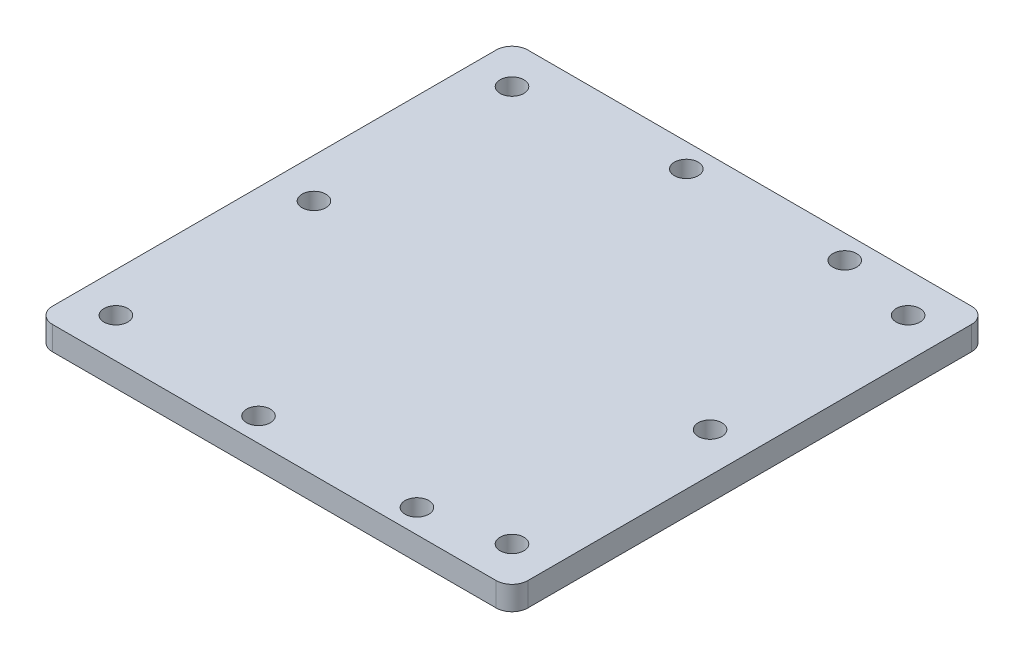
ISO-10303-21;
HEADER;
FILE_DESCRIPTION(('STEP AP214'),'2;1');
FILE_NAME('part.step','',(''),(''),'','','');
FILE_SCHEMA(('AUTOMOTIVE_DESIGN { 1 0 10303 214 1 1 1 1 }'));
ENDSEC;
DATA;
#1=APPLICATION_CONTEXT('core data for automotive mechanical design processes');
#2=APPLICATION_PROTOCOL_DEFINITION('international standard','automotive_design',2000,#1);
#3=PRODUCT_CONTEXT('',#1,'mechanical');
#4=PRODUCT('Part','Part','',(#3));
#5=PRODUCT_RELATED_PRODUCT_CATEGORY('part','',(#4));
#6=PRODUCT_DEFINITION_FORMATION('','',#4);
#7=PRODUCT_DEFINITION_CONTEXT('part definition',#1,'design');
#8=PRODUCT_DEFINITION('design','',#6,#7);
#9=PRODUCT_DEFINITION_SHAPE('','',#8);
#10=(LENGTH_UNIT() NAMED_UNIT(*) SI_UNIT(.MILLI.,.METRE.));
#11=(NAMED_UNIT(*) PLANE_ANGLE_UNIT() SI_UNIT($,.RADIAN.));
#12=(NAMED_UNIT(*) SI_UNIT($,.STERADIAN.) SOLID_ANGLE_UNIT());
#13=UNCERTAINTY_MEASURE_WITH_UNIT(LENGTH_MEASURE(1.E-05),#10,'distance_accuracy_value','');
#14=(GEOMETRIC_REPRESENTATION_CONTEXT(3) GLOBAL_UNCERTAINTY_ASSIGNED_CONTEXT((#13)) GLOBAL_UNIT_ASSIGNED_CONTEXT((#10,
#11,#12)) REPRESENTATION_CONTEXT('',''));
#15=CARTESIAN_POINT('',(0.,0.,0.));
#16=DIRECTION('',(0.,0.,1.));
#17=DIRECTION('',(1.,0.,0.));
#18=AXIS2_PLACEMENT_3D('',#15,#16,#17);
#19=CARTESIAN_POINT('',(0.,3.,0.));
#20=DIRECTION('',(0.,1.,0.));
#21=DIRECTION('',(0.,0.,1.));
#22=AXIS2_PLACEMENT_3D('',#19,#20,#21);
#23=PLANE('',#22);
#24=CARTESIAN_POINT('',(25.,3.,-25.));
#25=DIRECTION('',(0.,1.,0.));
#26=DIRECTION('',(0.,0.,1.));
#27=AXIS2_PLACEMENT_3D('',#24,#25,#26);
#28=CIRCLE('',#27,1.5);
#29=CARTESIAN_POINT('',(25.,3.,-23.5));
#30=VERTEX_POINT('',#29);
#31=EDGE_CURVE('E238',#30,#30,#28,.T.);
#32=ORIENTED_EDGE('',*,*,#31,.F.);
#33=EDGE_LOOP('',(#32));
#34=FACE_BOUND('',#33,.T.);
#35=CARTESIAN_POINT('',(-25.,3.,25.));
#36=DIRECTION('',(0.,1.,0.));
#37=DIRECTION('',(0.,0.,1.));
#38=AXIS2_PLACEMENT_3D('',#35,#36,#37);
#39=CIRCLE('',#38,1.5);
#40=CARTESIAN_POINT('',(-25.,3.,26.5));
#41=VERTEX_POINT('',#40);
#42=EDGE_CURVE('E243',#41,#41,#39,.T.);
#43=ORIENTED_EDGE('',*,*,#42,.F.);
#44=EDGE_LOOP('',(#43));
#45=FACE_BOUND('',#44,.T.);
#46=CARTESIAN_POINT('',(25.,3.,25.));
#47=DIRECTION('',(0.,1.,0.));
#48=DIRECTION('',(0.,0.,1.));
#49=AXIS2_PLACEMENT_3D('',#46,#47,#48);
#50=CIRCLE('',#49,1.5);
#51=CARTESIAN_POINT('',(25.,3.,26.5));
#52=VERTEX_POINT('',#51);
#53=EDGE_CURVE('E244',#52,#52,#50,.T.);
#54=ORIENTED_EDGE('',*,*,#53,.F.);
#55=EDGE_LOOP('',(#54));
#56=FACE_BOUND('',#55,.T.);
#57=CARTESIAN_POINT('',(-25.,3.,-25.));
#58=DIRECTION('',(0.,1.,0.));
#59=DIRECTION('',(0.,0.,1.));
#60=AXIS2_PLACEMENT_3D('',#57,#58,#59);
#61=CIRCLE('',#60,1.5);
#62=CARTESIAN_POINT('',(-25.,3.,-23.5));
#63=VERTEX_POINT('',#62);
#64=EDGE_CURVE('E156',#63,#63,#61,.T.);
#65=ORIENTED_EDGE('',*,*,#64,.F.);
#66=EDGE_LOOP('',(#65));
#67=FACE_BOUND('',#66,.T.);
#68=CARTESIAN_POINT('',(-25.,3.,0.));
#69=DIRECTION('',(0.,1.,0.));
#70=DIRECTION('',(0.,0.,1.));
#71=AXIS2_PLACEMENT_3D('',#68,#69,#70);
#72=CIRCLE('',#71,1.5);
#73=CARTESIAN_POINT('',(-25.,3.,1.50000000000001));
#74=VERTEX_POINT('',#73);
#75=EDGE_CURVE('E223',#74,#74,#72,.T.);
#76=ORIENTED_EDGE('',*,*,#75,.F.);
#77=EDGE_LOOP('',(#76));
#78=FACE_BOUND('',#77,.T.);
#79=CARTESIAN_POINT('',(15.,3.,27.));
#80=DIRECTION('',(0.,1.,0.));
#81=DIRECTION('',(0.,0.,-1.));
#82=AXIS2_PLACEMENT_3D('',#79,#80,#81);
#83=CIRCLE('',#82,1.5);
#84=CARTESIAN_POINT('',(15.,3.,25.5));
#85=VERTEX_POINT('',#84);
#86=EDGE_CURVE('E213',#85,#85,#83,.T.);
#87=ORIENTED_EDGE('',*,*,#86,.F.);
#88=EDGE_LOOP('',(#87));
#89=FACE_BOUND('',#88,.T.);
#90=CARTESIAN_POINT('',(-5.,3.,-27.));
#91=DIRECTION('',(0.,1.,0.));
#92=DIRECTION('',(0.,0.,1.));
#93=AXIS2_PLACEMENT_3D('',#90,#91,#92);
#94=CIRCLE('',#93,1.5);
#95=CARTESIAN_POINT('',(-5.,3.,-25.5));
#96=VERTEX_POINT('',#95);
#97=EDGE_CURVE('E137',#96,#96,#94,.T.);
#98=ORIENTED_EDGE('',*,*,#97,.F.);
#99=EDGE_LOOP('',(#98));
#100=FACE_BOUND('',#99,.T.);
#101=DIRECTION('',(1.,0.,0.));
#102=VECTOR('',#101,1.);
#103=CARTESIAN_POINT('',(-30.,3.,30.));
#104=LINE('',#103,#102);
#105=CARTESIAN_POINT('',(-28.,3.,30.));
#106=VERTEX_POINT('',#105);
#107=CARTESIAN_POINT('',(28.,3.,30.));
#108=VERTEX_POINT('',#107);
#109=EDGE_CURVE('E148',#106,#108,#104,.T.);
#110=ORIENTED_EDGE('',*,*,#109,.T.);
#111=CARTESIAN_POINT('',(28.,3.,28.));
#112=DIRECTION('',(0.,1.,0.));
#113=DIRECTION('',(0.,0.,1.));
#114=AXIS2_PLACEMENT_3D('',#111,#112,#113);
#115=CIRCLE('',#114,2.);
#116=CARTESIAN_POINT('',(30.,3.,28.));
#117=VERTEX_POINT('',#116);
#118=EDGE_CURVE('E179',#108,#117,#115,.T.);
#119=ORIENTED_EDGE('',*,*,#118,.T.);
#120=DIRECTION('',(0.,0.,-1.));
#121=VECTOR('',#120,1.);
#122=CARTESIAN_POINT('',(30.,3.,-30.));
#123=LINE('',#122,#121);
#124=CARTESIAN_POINT('',(30.,3.,-28.));
#125=VERTEX_POINT('',#124);
#126=EDGE_CURVE('E126',#117,#125,#123,.T.);
#127=ORIENTED_EDGE('',*,*,#126,.T.);
#128=CARTESIAN_POINT('',(28.,3.,-28.));
#129=DIRECTION('',(0.,1.,0.));
#130=DIRECTION('',(0.,0.,1.));
#131=AXIS2_PLACEMENT_3D('',#128,#129,#130);
#132=CIRCLE('',#131,2.);
#133=CARTESIAN_POINT('',(28.,3.,-30.));
#134=VERTEX_POINT('',#133);
#135=EDGE_CURVE('E174',#125,#134,#132,.T.);
#136=ORIENTED_EDGE('',*,*,#135,.T.);
#137=DIRECTION('',(-1.,0.,0.));
#138=VECTOR('',#137,1.);
#139=CARTESIAN_POINT('',(-30.,3.,-30.));
#140=LINE('',#139,#138);
#141=CARTESIAN_POINT('',(-28.,3.,-30.));
#142=VERTEX_POINT('',#141);
#143=EDGE_CURVE('E190',#134,#142,#140,.T.);
#144=ORIENTED_EDGE('',*,*,#143,.T.);
#145=CARTESIAN_POINT('',(-28.,3.,-28.));
#146=DIRECTION('',(0.,1.,0.));
#147=DIRECTION('',(0.,0.,1.));
#148=AXIS2_PLACEMENT_3D('',#145,#146,#147);
#149=CIRCLE('',#148,2.);
#150=CARTESIAN_POINT('',(-30.,3.,-28.));
#151=VERTEX_POINT('',#150);
#152=EDGE_CURVE('E61',#142,#151,#149,.T.);
#153=ORIENTED_EDGE('',*,*,#152,.T.);
#154=DIRECTION('',(0.,0.,1.));
#155=VECTOR('',#154,1.);
#156=CARTESIAN_POINT('',(-30.,3.,-30.));
#157=LINE('',#156,#155);
#158=CARTESIAN_POINT('',(-30.,3.,28.));
#159=VERTEX_POINT('',#158);
#160=EDGE_CURVE('E194',#151,#159,#157,.T.);
#161=ORIENTED_EDGE('',*,*,#160,.T.);
#162=CARTESIAN_POINT('',(-28.,3.,28.));
#163=DIRECTION('',(0.,1.,0.));
#164=DIRECTION('',(0.,0.,1.));
#165=AXIS2_PLACEMENT_3D('',#162,#163,#164);
#166=CIRCLE('',#165,2.);
#167=EDGE_CURVE('E176',#159,#106,#166,.T.);
#168=ORIENTED_EDGE('',*,*,#167,.T.);
#169=EDGE_LOOP('',(#110,#119,#127,#136,#144,#153,#161,#168));
#170=FACE_BOUND('',#169,.T.);
#171=CARTESIAN_POINT('',(15.,3.,-27.));
#172=DIRECTION('',(0.,1.,0.));
#173=DIRECTION('',(0.,0.,1.));
#174=AXIS2_PLACEMENT_3D('',#171,#172,#173);
#175=CIRCLE('',#174,1.5);
#176=CARTESIAN_POINT('',(15.,3.,-25.5));
#177=VERTEX_POINT('',#176);
#178=EDGE_CURVE('E208',#177,#177,#175,.T.);
#179=ORIENTED_EDGE('',*,*,#178,.F.);
#180=EDGE_LOOP('',(#179));
#181=FACE_BOUND('',#180,.T.);
#182=CARTESIAN_POINT('',(-5.,3.,27.));
#183=DIRECTION('',(0.,1.,0.));
#184=DIRECTION('',(0.,0.,-1.));
#185=AXIS2_PLACEMENT_3D('',#182,#183,#184);
#186=CIRCLE('',#185,1.5);
#187=CARTESIAN_POINT('',(-5.,3.,25.5));
#188=VERTEX_POINT('',#187);
#189=EDGE_CURVE('E218',#188,#188,#186,.T.);
#190=ORIENTED_EDGE('',*,*,#189,.F.);
#191=EDGE_LOOP('',(#190));
#192=FACE_BOUND('',#191,.T.);
#193=CARTESIAN_POINT('',(25.,3.,0.));
#194=DIRECTION('',(0.,1.,0.));
#195=DIRECTION('',(0.,0.,1.));
#196=AXIS2_PLACEMENT_3D('',#193,#194,#195);
#197=CIRCLE('',#196,1.5);
#198=CARTESIAN_POINT('',(25.,3.,1.5));
#199=VERTEX_POINT('',#198);
#200=EDGE_CURVE('E231',#199,#199,#197,.T.);
#201=ORIENTED_EDGE('',*,*,#200,.F.);
#202=EDGE_LOOP('',(#201));
#203=FACE_BOUND('',#202,.T.);
#204=ADVANCED_FACE('F41',(#34,#45,#56,#67,#78,#89,#100,#170,#181,#192,#203),#23,.T.);
#205=CARTESIAN_POINT('',(0.,0.,0.));
#206=DIRECTION('',(0.,1.,0.));
#207=DIRECTION('',(0.,0.,1.));
#208=AXIS2_PLACEMENT_3D('',#205,#206,#207);
#209=PLANE('',#208);
#210=CARTESIAN_POINT('',(25.,0.,-25.));
#211=DIRECTION('',(0.,1.,0.));
#212=DIRECTION('',(0.,0.,1.));
#213=AXIS2_PLACEMENT_3D('',#210,#211,#212);
#214=CIRCLE('',#213,1.5);
#215=CARTESIAN_POINT('',(25.,0.,-23.5));
#216=VERTEX_POINT('',#215);
#217=EDGE_CURVE('E165',#216,#216,#214,.T.);
#218=ORIENTED_EDGE('',*,*,#217,.T.);
#219=EDGE_LOOP('',(#218));
#220=FACE_BOUND('',#219,.T.);
#221=CARTESIAN_POINT('',(-25.,0.,25.));
#222=DIRECTION('',(0.,1.,0.));
#223=DIRECTION('',(0.,0.,1.));
#224=AXIS2_PLACEMENT_3D('',#221,#222,#223);
#225=CIRCLE('',#224,1.5);
#226=CARTESIAN_POINT('',(-25.,0.,26.5));
#227=VERTEX_POINT('',#226);
#228=EDGE_CURVE('E157',#227,#227,#225,.T.);
#229=ORIENTED_EDGE('',*,*,#228,.T.);
#230=EDGE_LOOP('',(#229));
#231=FACE_BOUND('',#230,.T.);
#232=CARTESIAN_POINT('',(25.,0.,25.));
#233=DIRECTION('',(0.,1.,0.));
#234=DIRECTION('',(0.,0.,1.));
#235=AXIS2_PLACEMENT_3D('',#232,#233,#234);
#236=CIRCLE('',#235,1.5);
#237=CARTESIAN_POINT('',(25.,0.,26.5));
#238=VERTEX_POINT('',#237);
#239=EDGE_CURVE('E154',#238,#238,#236,.T.);
#240=ORIENTED_EDGE('',*,*,#239,.T.);
#241=EDGE_LOOP('',(#240));
#242=FACE_BOUND('',#241,.T.);
#243=CARTESIAN_POINT('',(-25.,0.,-25.));
#244=DIRECTION('',(0.,1.,0.));
#245=DIRECTION('',(0.,0.,1.));
#246=AXIS2_PLACEMENT_3D('',#243,#244,#245);
#247=CIRCLE('',#246,1.5);
#248=CARTESIAN_POINT('',(-25.,0.,-23.5));
#249=VERTEX_POINT('',#248);
#250=EDGE_CURVE('E155',#249,#249,#247,.T.);
#251=ORIENTED_EDGE('',*,*,#250,.T.);
#252=EDGE_LOOP('',(#251));
#253=FACE_BOUND('',#252,.T.);
#254=DIRECTION('',(0.,0.,-1.));
#255=VECTOR('',#254,1.);
#256=CARTESIAN_POINT('',(30.,0.,-30.));
#257=LINE('',#256,#255);
#258=CARTESIAN_POINT('',(30.,0.,28.));
#259=VERTEX_POINT('',#258);
#260=CARTESIAN_POINT('',(30.,0.,-28.));
#261=VERTEX_POINT('',#260);
#262=EDGE_CURVE('E125',#259,#261,#257,.T.);
#263=ORIENTED_EDGE('',*,*,#262,.F.);
#264=CARTESIAN_POINT('',(28.,0.,28.));
#265=DIRECTION('',(0.,1.,0.));
#266=DIRECTION('',(0.,0.,1.));
#267=AXIS2_PLACEMENT_3D('',#264,#265,#266);
#268=CIRCLE('',#267,2.);
#269=CARTESIAN_POINT('',(28.,0.,30.));
#270=VERTEX_POINT('',#269);
#271=EDGE_CURVE('E107',#259,#270,#268,.F.);
#272=ORIENTED_EDGE('',*,*,#271,.T.);
#273=DIRECTION('',(1.,0.,0.));
#274=VECTOR('',#273,1.);
#275=CARTESIAN_POINT('',(-30.,0.,30.));
#276=LINE('',#275,#274);
#277=CARTESIAN_POINT('',(-28.,0.,30.));
#278=VERTEX_POINT('',#277);
#279=EDGE_CURVE('E147',#278,#270,#276,.T.);
#280=ORIENTED_EDGE('',*,*,#279,.F.);
#281=CARTESIAN_POINT('',(-28.,0.,28.));
#282=DIRECTION('',(0.,1.,0.));
#283=DIRECTION('',(0.,0.,1.));
#284=AXIS2_PLACEMENT_3D('',#281,#282,#283);
#285=CIRCLE('',#284,2.);
#286=CARTESIAN_POINT('',(-30.,0.,28.));
#287=VERTEX_POINT('',#286);
#288=EDGE_CURVE('E119',#278,#287,#285,.F.);
#289=ORIENTED_EDGE('',*,*,#288,.T.);
#290=DIRECTION('',(0.,0.,1.));
#291=VECTOR('',#290,1.);
#292=CARTESIAN_POINT('',(-30.,0.,-30.));
#293=LINE('',#292,#291);
#294=CARTESIAN_POINT('',(-30.,0.,-28.));
#295=VERTEX_POINT('',#294);
#296=EDGE_CURVE('E140',#295,#287,#293,.T.);
#297=ORIENTED_EDGE('',*,*,#296,.F.);
#298=CARTESIAN_POINT('',(-28.,0.,-28.));
#299=DIRECTION('',(0.,1.,0.));
#300=DIRECTION('',(0.,0.,1.));
#301=AXIS2_PLACEMENT_3D('',#298,#299,#300);
#302=CIRCLE('',#301,2.);
#303=CARTESIAN_POINT('',(-28.,0.,-30.));
#304=VERTEX_POINT('',#303);
#305=EDGE_CURVE('E129',#295,#304,#302,.F.);
#306=ORIENTED_EDGE('',*,*,#305,.T.);
#307=DIRECTION('',(-1.,0.,0.));
#308=VECTOR('',#307,1.);
#309=CARTESIAN_POINT('',(-30.,0.,-30.));
#310=LINE('',#309,#308);
#311=CARTESIAN_POINT('',(28.,0.,-30.));
#312=VERTEX_POINT('',#311);
#313=EDGE_CURVE('E136',#312,#304,#310,.T.);
#314=ORIENTED_EDGE('',*,*,#313,.F.);
#315=CARTESIAN_POINT('',(28.,0.,-28.));
#316=DIRECTION('',(0.,1.,0.));
#317=DIRECTION('',(0.,0.,1.));
#318=AXIS2_PLACEMENT_3D('',#315,#316,#317);
#319=CIRCLE('',#318,2.);
#320=EDGE_CURVE('E132',#312,#261,#319,.F.);
#321=ORIENTED_EDGE('',*,*,#320,.T.);
#322=EDGE_LOOP('',(#263,#272,#280,#289,#297,#306,#314,#321));
#323=FACE_BOUND('',#322,.T.);
#324=CARTESIAN_POINT('',(-5.,0.,-27.));
#325=DIRECTION('',(0.,1.,0.));
#326=DIRECTION('',(0.,0.,1.));
#327=AXIS2_PLACEMENT_3D('',#324,#325,#326);
#328=CIRCLE('',#327,1.5);
#329=CARTESIAN_POINT('',(-5.,0.,-25.5));
#330=VERTEX_POINT('',#329);
#331=EDGE_CURVE('E141',#330,#330,#328,.T.);
#332=ORIENTED_EDGE('',*,*,#331,.T.);
#333=EDGE_LOOP('',(#332));
#334=FACE_BOUND('',#333,.T.);
#335=CARTESIAN_POINT('',(15.,0.,-27.));
#336=DIRECTION('',(0.,1.,0.));
#337=DIRECTION('',(0.,0.,1.));
#338=AXIS2_PLACEMENT_3D('',#335,#336,#337);
#339=CIRCLE('',#338,1.5);
#340=CARTESIAN_POINT('',(15.,0.,-25.5));
#341=VERTEX_POINT('',#340);
#342=EDGE_CURVE('E209',#341,#341,#339,.T.);
#343=ORIENTED_EDGE('',*,*,#342,.T.);
#344=EDGE_LOOP('',(#343));
#345=FACE_BOUND('',#344,.T.);
#346=CARTESIAN_POINT('',(15.,0.,27.));
#347=DIRECTION('',(0.,1.,0.));
#348=DIRECTION('',(0.,0.,-1.));
#349=AXIS2_PLACEMENT_3D('',#346,#347,#348);
#350=CIRCLE('',#349,1.5);
#351=CARTESIAN_POINT('',(15.,0.,25.5));
#352=VERTEX_POINT('',#351);
#353=EDGE_CURVE('E216',#352,#352,#350,.T.);
#354=ORIENTED_EDGE('',*,*,#353,.T.);
#355=EDGE_LOOP('',(#354));
#356=FACE_BOUND('',#355,.T.);
#357=CARTESIAN_POINT('',(-5.,0.,27.));
#358=DIRECTION('',(0.,1.,0.));
#359=DIRECTION('',(0.,0.,-1.));
#360=AXIS2_PLACEMENT_3D('',#357,#358,#359);
#361=CIRCLE('',#360,1.5);
#362=CARTESIAN_POINT('',(-5.,0.,25.5));
#363=VERTEX_POINT('',#362);
#364=EDGE_CURVE('E225',#363,#363,#361,.T.);
#365=ORIENTED_EDGE('',*,*,#364,.T.);
#366=EDGE_LOOP('',(#365));
#367=FACE_BOUND('',#366,.T.);
#368=CARTESIAN_POINT('',(-25.,0.,0.));
#369=DIRECTION('',(0.,1.,0.));
#370=DIRECTION('',(0.,0.,1.));
#371=AXIS2_PLACEMENT_3D('',#368,#369,#370);
#372=CIRCLE('',#371,1.5);
#373=CARTESIAN_POINT('',(-25.,0.,1.50000000000001));
#374=VERTEX_POINT('',#373);
#375=EDGE_CURVE('E226',#374,#374,#372,.T.);
#376=ORIENTED_EDGE('',*,*,#375,.T.);
#377=EDGE_LOOP('',(#376));
#378=FACE_BOUND('',#377,.T.);
#379=CARTESIAN_POINT('',(25.,0.,0.));
#380=DIRECTION('',(0.,1.,0.));
#381=DIRECTION('',(0.,0.,1.));
#382=AXIS2_PLACEMENT_3D('',#379,#380,#381);
#383=CIRCLE('',#382,1.5);
#384=CARTESIAN_POINT('',(25.,0.,1.5));
#385=VERTEX_POINT('',#384);
#386=EDGE_CURVE('E164',#385,#385,#383,.T.);
#387=ORIENTED_EDGE('',*,*,#386,.T.);
#388=EDGE_LOOP('',(#387));
#389=FACE_BOUND('',#388,.T.);
#390=ADVANCED_FACE('F135',(#220,#231,#242,#253,#323,#334,#345,#356,#367,#378,#389),#209,.F.);
#391=CARTESIAN_POINT('',(30.,3.,-30.));
#392=DIRECTION('',(-1.,0.,0.));
#393=DIRECTION('',(0.,0.,1.));
#394=AXIS2_PLACEMENT_3D('',#391,#392,#393);
#395=PLANE('',#394);
#396=ORIENTED_EDGE('',*,*,#126,.F.);
#397=DIRECTION('',(0.,-1.,0.));
#398=VECTOR('',#397,1.);
#399=CARTESIAN_POINT('',(30.,3.,28.));
#400=LINE('',#399,#398);
#401=EDGE_CURVE('E115',#117,#259,#400,.T.);
#402=ORIENTED_EDGE('',*,*,#401,.T.);
#403=ORIENTED_EDGE('',*,*,#262,.T.);
#404=DIRECTION('',(0.,-1.,0.));
#405=VECTOR('',#404,1.);
#406=CARTESIAN_POINT('',(30.,3.,-28.));
#407=LINE('',#406,#405);
#408=EDGE_CURVE('E128',#261,#125,#407,.F.);
#409=ORIENTED_EDGE('',*,*,#408,.T.);
#410=EDGE_LOOP('',(#396,#402,#403,#409));
#411=FACE_BOUND('',#410,.T.);
#412=ADVANCED_FACE('F123',(#411),#395,.F.);
#413=CARTESIAN_POINT('',(-30.,3.,-30.));
#414=DIRECTION('',(0.,0.,1.));
#415=DIRECTION('',(1.,0.,0.));
#416=AXIS2_PLACEMENT_3D('',#413,#414,#415);
#417=PLANE('',#416);
#418=ORIENTED_EDGE('',*,*,#143,.F.);
#419=DIRECTION('',(0.,-1.,0.));
#420=VECTOR('',#419,1.);
#421=CARTESIAN_POINT('',(28.,3.,-30.));
#422=LINE('',#421,#420);
#423=EDGE_CURVE('E11',#134,#312,#422,.T.);
#424=ORIENTED_EDGE('',*,*,#423,.T.);
#425=ORIENTED_EDGE('',*,*,#313,.T.);
#426=DIRECTION('',(0.,-1.,0.));
#427=VECTOR('',#426,1.);
#428=CARTESIAN_POINT('',(-28.,3.,-30.));
#429=LINE('',#428,#427);
#430=EDGE_CURVE('E47',#304,#142,#429,.F.);
#431=ORIENTED_EDGE('',*,*,#430,.T.);
#432=EDGE_LOOP('',(#418,#424,#425,#431));
#433=FACE_BOUND('',#432,.T.);
#434=ADVANCED_FACE('F188',(#433),#417,.F.);
#435=CARTESIAN_POINT('',(-30.,3.,-30.));
#436=DIRECTION('',(1.,0.,0.));
#437=DIRECTION('',(0.,0.,-1.));
#438=AXIS2_PLACEMENT_3D('',#435,#436,#437);
#439=PLANE('',#438);
#440=ORIENTED_EDGE('',*,*,#296,.T.);
#441=DIRECTION('',(0.,-1.,0.));
#442=VECTOR('',#441,1.);
#443=CARTESIAN_POINT('',(-30.,3.,28.));
#444=LINE('',#443,#442);
#445=EDGE_CURVE('E57',#287,#159,#444,.F.);
#446=ORIENTED_EDGE('',*,*,#445,.T.);
#447=ORIENTED_EDGE('',*,*,#160,.F.);
#448=DIRECTION('',(0.,-1.,0.));
#449=VECTOR('',#448,1.);
#450=CARTESIAN_POINT('',(-30.,3.,-28.));
#451=LINE('',#450,#449);
#452=EDGE_CURVE('E180',#151,#295,#451,.T.);
#453=ORIENTED_EDGE('',*,*,#452,.T.);
#454=EDGE_LOOP('',(#440,#446,#447,#453));
#455=FACE_BOUND('',#454,.T.);
#456=ADVANCED_FACE('F197',(#455),#439,.F.);
#457=CARTESIAN_POINT('',(-30.,3.,30.));
#458=DIRECTION('',(0.,0.,-1.));
#459=DIRECTION('',(-1.,0.,0.));
#460=AXIS2_PLACEMENT_3D('',#457,#458,#459);
#461=PLANE('',#460);
#462=ORIENTED_EDGE('',*,*,#279,.T.);
#463=DIRECTION('',(0.,-1.,0.));
#464=VECTOR('',#463,1.);
#465=CARTESIAN_POINT('',(28.,3.,30.));
#466=LINE('',#465,#464);
#467=EDGE_CURVE('E114',#270,#108,#466,.F.);
#468=ORIENTED_EDGE('',*,*,#467,.T.);
#469=ORIENTED_EDGE('',*,*,#109,.F.);
#470=DIRECTION('',(0.,-1.,0.));
#471=VECTOR('',#470,1.);
#472=CARTESIAN_POINT('',(-28.,3.,30.));
#473=LINE('',#472,#471);
#474=EDGE_CURVE('E116',#106,#278,#473,.T.);
#475=ORIENTED_EDGE('',*,*,#474,.T.);
#476=EDGE_LOOP('',(#462,#468,#469,#475));
#477=FACE_BOUND('',#476,.T.);
#478=ADVANCED_FACE('F204',(#477),#461,.F.);
#479=CARTESIAN_POINT('',(-5.,3.,-27.));
#480=DIRECTION('',(0.,-1.,0.));
#481=DIRECTION('',(0.,0.,-1.));
#482=AXIS2_PLACEMENT_3D('',#479,#480,#481);
#483=CYLINDRICAL_SURFACE('',#482,1.5);
#484=ORIENTED_EDGE('',*,*,#97,.T.);
#485=EDGE_LOOP('',(#484));
#486=FACE_BOUND('',#485,.T.);
#487=ORIENTED_EDGE('',*,*,#331,.F.);
#488=EDGE_LOOP('',(#487));
#489=FACE_BOUND('',#488,.T.);
#490=ADVANCED_FACE('F264',(#486,#489),#483,.F.);
#491=CARTESIAN_POINT('',(15.,3.,-27.));
#492=DIRECTION('',(0.,-1.,0.));
#493=DIRECTION('',(0.,0.,-1.));
#494=AXIS2_PLACEMENT_3D('',#491,#492,#493);
#495=CYLINDRICAL_SURFACE('',#494,1.5);
#496=ORIENTED_EDGE('',*,*,#178,.T.);
#497=EDGE_LOOP('',(#496));
#498=FACE_BOUND('',#497,.T.);
#499=ORIENTED_EDGE('',*,*,#342,.F.);
#500=EDGE_LOOP('',(#499));
#501=FACE_BOUND('',#500,.T.);
#502=ADVANCED_FACE('F268',(#498,#501),#495,.F.);
#503=CARTESIAN_POINT('',(15.,3.,27.));
#504=DIRECTION('',(0.,-1.,0.));
#505=DIRECTION('',(0.,0.,-1.));
#506=AXIS2_PLACEMENT_3D('',#503,#504,#505);
#507=CYLINDRICAL_SURFACE('',#506,1.5);
#508=ORIENTED_EDGE('',*,*,#86,.T.);
#509=EDGE_LOOP('',(#508));
#510=FACE_BOUND('',#509,.T.);
#511=ORIENTED_EDGE('',*,*,#353,.F.);
#512=EDGE_LOOP('',(#511));
#513=FACE_BOUND('',#512,.T.);
#514=ADVANCED_FACE('F303',(#510,#513),#507,.F.);
#515=CARTESIAN_POINT('',(-5.,3.,27.));
#516=DIRECTION('',(0.,-1.,0.));
#517=DIRECTION('',(0.,0.,-1.));
#518=AXIS2_PLACEMENT_3D('',#515,#516,#517);
#519=CYLINDRICAL_SURFACE('',#518,1.5);
#520=ORIENTED_EDGE('',*,*,#189,.T.);
#521=EDGE_LOOP('',(#520));
#522=FACE_BOUND('',#521,.T.);
#523=ORIENTED_EDGE('',*,*,#364,.F.);
#524=EDGE_LOOP('',(#523));
#525=FACE_BOUND('',#524,.T.);
#526=ADVANCED_FACE('F300',(#522,#525),#519,.F.);
#527=CARTESIAN_POINT('',(-25.,3.,0.));
#528=DIRECTION('',(0.,-1.,0.));
#529=DIRECTION('',(0.,0.,-1.));
#530=AXIS2_PLACEMENT_3D('',#527,#528,#529);
#531=CYLINDRICAL_SURFACE('',#530,1.5);
#532=ORIENTED_EDGE('',*,*,#75,.T.);
#533=EDGE_LOOP('',(#532));
#534=FACE_BOUND('',#533,.T.);
#535=ORIENTED_EDGE('',*,*,#375,.F.);
#536=EDGE_LOOP('',(#535));
#537=FACE_BOUND('',#536,.T.);
#538=ADVANCED_FACE('F289',(#534,#537),#531,.F.);
#539=CARTESIAN_POINT('',(25.,3.,0.));
#540=DIRECTION('',(0.,-1.,0.));
#541=DIRECTION('',(0.,0.,-1.));
#542=AXIS2_PLACEMENT_3D('',#539,#540,#541);
#543=CYLINDRICAL_SURFACE('',#542,1.5);
#544=ORIENTED_EDGE('',*,*,#200,.T.);
#545=EDGE_LOOP('',(#544));
#546=FACE_BOUND('',#545,.T.);
#547=ORIENTED_EDGE('',*,*,#386,.F.);
#548=EDGE_LOOP('',(#547));
#549=FACE_BOUND('',#548,.T.);
#550=ADVANCED_FACE('F282',(#546,#549),#543,.F.);
#551=CARTESIAN_POINT('',(-25.,-7.,-25.));
#552=DIRECTION('',(0.,1.,0.));
#553=DIRECTION('',(0.,0.,1.));
#554=AXIS2_PLACEMENT_3D('',#551,#552,#553);
#555=CYLINDRICAL_SURFACE('',#554,1.5);
#556=ORIENTED_EDGE('',*,*,#64,.T.);
#557=EDGE_LOOP('',(#556));
#558=FACE_BOUND('',#557,.T.);
#559=ORIENTED_EDGE('',*,*,#250,.F.);
#560=EDGE_LOOP('',(#559));
#561=FACE_BOUND('',#560,.T.);
#562=ADVANCED_FACE('F287',(#558,#561),#555,.F.);
#563=CARTESIAN_POINT('',(25.,-7.,25.));
#564=DIRECTION('',(0.,1.,0.));
#565=DIRECTION('',(0.,0.,1.));
#566=AXIS2_PLACEMENT_3D('',#563,#564,#565);
#567=CYLINDRICAL_SURFACE('',#566,1.5);
#568=ORIENTED_EDGE('',*,*,#53,.T.);
#569=EDGE_LOOP('',(#568));
#570=FACE_BOUND('',#569,.T.);
#571=ORIENTED_EDGE('',*,*,#239,.F.);
#572=EDGE_LOOP('',(#571));
#573=FACE_BOUND('',#572,.T.);
#574=ADVANCED_FACE('F250',(#570,#573),#567,.F.);
#575=CARTESIAN_POINT('',(-25.,-7.,25.));
#576=DIRECTION('',(0.,1.,0.));
#577=DIRECTION('',(0.,0.,1.));
#578=AXIS2_PLACEMENT_3D('',#575,#576,#577);
#579=CYLINDRICAL_SURFACE('',#578,1.5);
#580=ORIENTED_EDGE('',*,*,#42,.T.);
#581=EDGE_LOOP('',(#580));
#582=FACE_BOUND('',#581,.T.);
#583=ORIENTED_EDGE('',*,*,#228,.F.);
#584=EDGE_LOOP('',(#583));
#585=FACE_BOUND('',#584,.T.);
#586=ADVANCED_FACE('F359',(#582,#585),#579,.F.);
#587=CARTESIAN_POINT('',(25.,-7.,-25.));
#588=DIRECTION('',(0.,1.,0.));
#589=DIRECTION('',(0.,0.,1.));
#590=AXIS2_PLACEMENT_3D('',#587,#588,#589);
#591=CYLINDRICAL_SURFACE('',#590,1.5);
#592=ORIENTED_EDGE('',*,*,#31,.T.);
#593=EDGE_LOOP('',(#592));
#594=FACE_BOUND('',#593,.T.);
#595=ORIENTED_EDGE('',*,*,#217,.F.);
#596=EDGE_LOOP('',(#595));
#597=FACE_BOUND('',#596,.T.);
#598=ADVANCED_FACE('F325',(#594,#597),#591,.F.);
#599=CARTESIAN_POINT('',(28.,3.,28.));
#600=DIRECTION('',(0.,-1.,0.));
#601=DIRECTION('',(0.,0.,-1.));
#602=AXIS2_PLACEMENT_3D('',#599,#600,#601);
#603=CYLINDRICAL_SURFACE('',#602,2.);
#604=ORIENTED_EDGE('',*,*,#118,.F.);
#605=ORIENTED_EDGE('',*,*,#467,.F.);
#606=ORIENTED_EDGE('',*,*,#271,.F.);
#607=ORIENTED_EDGE('',*,*,#401,.F.);
#608=EDGE_LOOP('',(#604,#605,#606,#607));
#609=FACE_BOUND('',#608,.T.);
#610=ADVANCED_FACE('F112',(#609),#603,.T.);
#611=CARTESIAN_POINT('',(-28.,3.,28.));
#612=DIRECTION('',(0.,-1.,0.));
#613=DIRECTION('',(0.,0.,-1.));
#614=AXIS2_PLACEMENT_3D('',#611,#612,#613);
#615=CYLINDRICAL_SURFACE('',#614,2.);
#616=ORIENTED_EDGE('',*,*,#167,.F.);
#617=ORIENTED_EDGE('',*,*,#445,.F.);
#618=ORIENTED_EDGE('',*,*,#288,.F.);
#619=ORIENTED_EDGE('',*,*,#474,.F.);
#620=EDGE_LOOP('',(#616,#617,#618,#619));
#621=FACE_BOUND('',#620,.T.);
#622=ADVANCED_FACE('F203',(#621),#615,.T.);
#623=CARTESIAN_POINT('',(28.,3.,-28.));
#624=DIRECTION('',(0.,-1.,0.));
#625=DIRECTION('',(0.,0.,-1.));
#626=AXIS2_PLACEMENT_3D('',#623,#624,#625);
#627=CYLINDRICAL_SURFACE('',#626,2.);
#628=ORIENTED_EDGE('',*,*,#135,.F.);
#629=ORIENTED_EDGE('',*,*,#408,.F.);
#630=ORIENTED_EDGE('',*,*,#320,.F.);
#631=ORIENTED_EDGE('',*,*,#423,.F.);
#632=EDGE_LOOP('',(#628,#629,#630,#631));
#633=FACE_BOUND('',#632,.T.);
#634=ADVANCED_FACE('F322',(#633),#627,.T.);
#635=CARTESIAN_POINT('',(-28.,3.,-28.));
#636=DIRECTION('',(0.,-1.,0.));
#637=DIRECTION('',(0.,0.,-1.));
#638=AXIS2_PLACEMENT_3D('',#635,#636,#637);
#639=CYLINDRICAL_SURFACE('',#638,2.);
#640=ORIENTED_EDGE('',*,*,#152,.F.);
#641=ORIENTED_EDGE('',*,*,#430,.F.);
#642=ORIENTED_EDGE('',*,*,#305,.F.);
#643=ORIENTED_EDGE('',*,*,#452,.F.);
#644=EDGE_LOOP('',(#640,#641,#642,#643));
#645=FACE_BOUND('',#644,.T.);
#646=ADVANCED_FACE('F43',(#645),#639,.T.);
#647=CLOSED_SHELL('',(#204,#390,#412,#434,#456,#478,#490,#502,#514,#526,#538,#550,#562,#574,
#586,#598,#610,#622,#634,#646));
#648=MANIFOLD_SOLID_BREP('B2',#647);
#649=ADVANCED_BREP_SHAPE_REPRESENTATION('',(#18,#648),#14);
#650=SHAPE_DEFINITION_REPRESENTATION(#9,#649);
ENDSEC;
END-ISO-10303-21;
